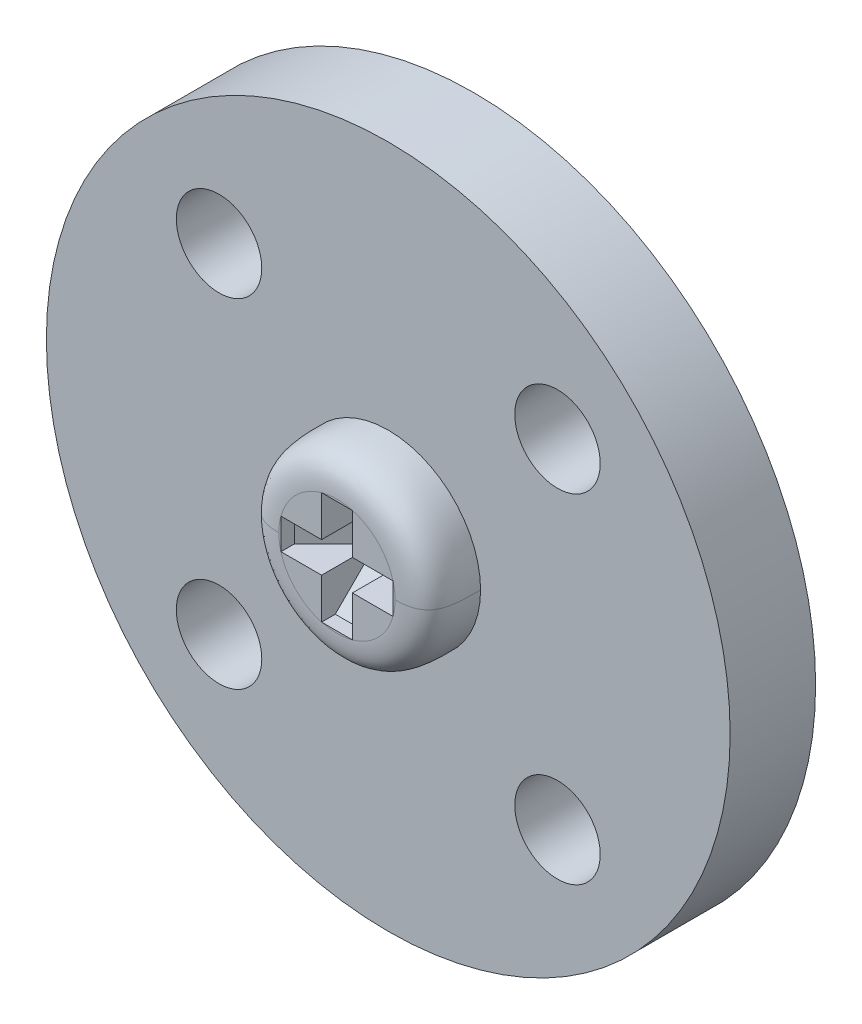
ISO-10303-21;
HEADER;
FILE_DESCRIPTION(('STEP AP214'),'2;1');
FILE_NAME('part.step','',(''),(''),'','','');
FILE_SCHEMA(('AUTOMOTIVE_DESIGN { 1 0 10303 214 1 1 1 1 }'));
ENDSEC;
DATA;
#1=APPLICATION_CONTEXT('core data for automotive mechanical design processes');
#2=APPLICATION_PROTOCOL_DEFINITION('international standard','automotive_design',2000,#1);
#3=PRODUCT_CONTEXT('',#1,'mechanical');
#4=PRODUCT('Part','Part','',(#3));
#5=PRODUCT_RELATED_PRODUCT_CATEGORY('part','',(#4));
#6=PRODUCT_DEFINITION_FORMATION('','',#4);
#7=PRODUCT_DEFINITION_CONTEXT('part definition',#1,'design');
#8=PRODUCT_DEFINITION('design','',#6,#7);
#9=PRODUCT_DEFINITION_SHAPE('','',#8);
#10=(LENGTH_UNIT() NAMED_UNIT(*) SI_UNIT(.MILLI.,.METRE.));
#11=(NAMED_UNIT(*) PLANE_ANGLE_UNIT() SI_UNIT($,.RADIAN.));
#12=(NAMED_UNIT(*) SI_UNIT($,.STERADIAN.) SOLID_ANGLE_UNIT());
#13=UNCERTAINTY_MEASURE_WITH_UNIT(LENGTH_MEASURE(1.E-05),#10,'distance_accuracy_value','');
#14=(GEOMETRIC_REPRESENTATION_CONTEXT(3) GLOBAL_UNCERTAINTY_ASSIGNED_CONTEXT((#13)) GLOBAL_UNIT_ASSIGNED_CONTEXT((#10,
#11,#12)) REPRESENTATION_CONTEXT('',''));
#15=CARTESIAN_POINT('',(0.,0.,0.));
#16=DIRECTION('',(0.,0.,1.));
#17=DIRECTION('',(1.,0.,0.));
#18=AXIS2_PLACEMENT_3D('',#15,#16,#17);
#19=CARTESIAN_POINT('',(12.5,0.,16.2));
#20=DIRECTION('',(0.,0.,1.));
#21=DIRECTION('',(1.,0.,0.));
#22=AXIS2_PLACEMENT_3D('',#19,#20,#21);
#23=PLANE('',#22);
#24=CARTESIAN_POINT('',(12.5,0.,16.2));
#25=DIRECTION('',(0.,0.,-1.));
#26=DIRECTION('',(1.,0.,0.));
#27=AXIS2_PLACEMENT_3D('',#24,#25,#26);
#28=CIRCLE('',#27,4.5);
#29=CARTESIAN_POINT('',(17.,0.,16.2));
#30=VERTEX_POINT('',#29);
#31=EDGE_CURVE('E68',#30,#30,#28,.T.);
#32=ORIENTED_EDGE('',*,*,#31,.F.);
#33=EDGE_LOOP('',(#32));
#34=FACE_BOUND('',#33,.T.);
#35=CARTESIAN_POINT('',(17.4497474683058,-4.94974746830583,16.2));
#36=DIRECTION('',(0.,0.,1.));
#37=DIRECTION('',(1.,0.,0.));
#38=AXIS2_PLACEMENT_3D('',#35,#36,#37);
#39=CIRCLE('',#38,1.25);
#40=CARTESIAN_POINT('',(18.6997474683058,-4.94974746830583,16.2));
#41=VERTEX_POINT('',#40);
#42=EDGE_CURVE('E226',#41,#41,#39,.T.);
#43=ORIENTED_EDGE('',*,*,#42,.T.);
#44=EDGE_LOOP('',(#43));
#45=FACE_BOUND('',#44,.T.);
#46=CARTESIAN_POINT('',(7.55025253169417,-4.94974746830583,16.2));
#47=DIRECTION('',(0.,0.,1.));
#48=DIRECTION('',(1.,0.,0.));
#49=AXIS2_PLACEMENT_3D('',#46,#47,#48);
#50=CIRCLE('',#49,1.25);
#51=CARTESIAN_POINT('',(8.80025253169417,-4.94974746830583,16.2));
#52=VERTEX_POINT('',#51);
#53=EDGE_CURVE('E215',#52,#52,#50,.T.);
#54=ORIENTED_EDGE('',*,*,#53,.T.);
#55=EDGE_LOOP('',(#54));
#56=FACE_BOUND('',#55,.T.);
#57=CARTESIAN_POINT('',(7.55025253169417,4.94974746830583,16.2));
#58=DIRECTION('',(0.,0.,1.));
#59=DIRECTION('',(1.,0.,0.));
#60=AXIS2_PLACEMENT_3D('',#57,#58,#59);
#61=CIRCLE('',#60,1.25);
#62=CARTESIAN_POINT('',(8.80025253169417,4.94974746830583,16.2));
#63=VERTEX_POINT('',#62);
#64=EDGE_CURVE('E208',#63,#63,#61,.T.);
#65=ORIENTED_EDGE('',*,*,#64,.T.);
#66=EDGE_LOOP('',(#65));
#67=FACE_BOUND('',#66,.T.);
#68=CARTESIAN_POINT('',(17.4497474683058,4.94974746830583,16.2));
#69=DIRECTION('',(0.,0.,1.));
#70=DIRECTION('',(1.,0.,0.));
#71=AXIS2_PLACEMENT_3D('',#68,#69,#70);
#72=CIRCLE('',#71,1.25);
#73=CARTESIAN_POINT('',(18.6997474683058,4.94974746830583,16.2));
#74=VERTEX_POINT('',#73);
#75=EDGE_CURVE('E32',#74,#74,#72,.T.);
#76=ORIENTED_EDGE('',*,*,#75,.T.);
#77=EDGE_LOOP('',(#76));
#78=FACE_BOUND('',#77,.T.);
#79=CARTESIAN_POINT('',(12.5,0.,16.2));
#80=DIRECTION('',(0.,0.,1.));
#81=DIRECTION('',(1.,0.,0.));
#82=AXIS2_PLACEMENT_3D('',#79,#80,#81);
#83=CIRCLE('',#82,10.);
#84=CARTESIAN_POINT('',(22.5,0.,16.2));
#85=VERTEX_POINT('',#84);
#86=EDGE_CURVE('E11',#85,#85,#83,.T.);
#87=ORIENTED_EDGE('',*,*,#86,.F.);
#88=EDGE_LOOP('',(#87));
#89=FACE_BOUND('',#88,.T.);
#90=ADVANCED_FACE('F17',(#34,#45,#56,#67,#78,#89),#23,.F.);
#91=CARTESIAN_POINT('',(12.5,0.,18.7));
#92=DIRECTION('',(0.,0.,-1.));
#93=DIRECTION('',(-1.,0.,0.));
#94=AXIS2_PLACEMENT_3D('',#91,#92,#93);
#95=CYLINDRICAL_SURFACE('',#94,10.);
#96=CARTESIAN_POINT('',(12.5,0.,18.7));
#97=DIRECTION('',(0.,0.,1.));
#98=DIRECTION('',(1.,0.,0.));
#99=AXIS2_PLACEMENT_3D('',#96,#97,#98);
#100=CIRCLE('',#99,10.);
#101=CARTESIAN_POINT('',(22.5,0.,18.7));
#102=VERTEX_POINT('',#101);
#103=EDGE_CURVE('E160',#102,#102,#100,.T.);
#104=ORIENTED_EDGE('',*,*,#103,.F.);
#105=EDGE_LOOP('',(#104));
#106=FACE_BOUND('',#105,.T.);
#107=ORIENTED_EDGE('',*,*,#86,.T.);
#108=EDGE_LOOP('',(#107));
#109=FACE_BOUND('',#108,.T.);
#110=ADVANCED_FACE('F401',(#106,#109),#95,.T.);
#111=CARTESIAN_POINT('',(17.4497474683058,4.94974746830583,18.7));
#112=DIRECTION('',(0.,0.,-1.));
#113=DIRECTION('',(-1.,0.,0.));
#114=AXIS2_PLACEMENT_3D('',#111,#112,#113);
#115=CYLINDRICAL_SURFACE('',#114,1.25);
#116=ORIENTED_EDGE('',*,*,#75,.F.);
#117=EDGE_LOOP('',(#116));
#118=FACE_BOUND('',#117,.T.);
#119=CARTESIAN_POINT('',(17.4497474683058,4.94974746830583,18.7));
#120=DIRECTION('',(0.,0.,1.));
#121=DIRECTION('',(1.,0.,0.));
#122=AXIS2_PLACEMENT_3D('',#119,#120,#121);
#123=CIRCLE('',#122,1.25);
#124=CARTESIAN_POINT('',(18.6997474683058,4.94974746830583,18.7));
#125=VERTEX_POINT('',#124);
#126=EDGE_CURVE('E233',#125,#125,#123,.T.);
#127=ORIENTED_EDGE('',*,*,#126,.T.);
#128=EDGE_LOOP('',(#127));
#129=FACE_BOUND('',#128,.T.);
#130=ADVANCED_FACE('F398',(#118,#129),#115,.F.);
#131=CARTESIAN_POINT('',(7.55025253169417,4.94974746830583,18.7));
#132=DIRECTION('',(0.,0.,-1.));
#133=DIRECTION('',(-1.,0.,0.));
#134=AXIS2_PLACEMENT_3D('',#131,#132,#133);
#135=CYLINDRICAL_SURFACE('',#134,1.25);
#136=ORIENTED_EDGE('',*,*,#64,.F.);
#137=EDGE_LOOP('',(#136));
#138=FACE_BOUND('',#137,.T.);
#139=CARTESIAN_POINT('',(7.55025253169417,4.94974746830583,18.7));
#140=DIRECTION('',(0.,0.,1.));
#141=DIRECTION('',(1.,0.,0.));
#142=AXIS2_PLACEMENT_3D('',#139,#140,#141);
#143=CIRCLE('',#142,1.25);
#144=CARTESIAN_POINT('',(8.80025253169417,4.94974746830583,18.7));
#145=VERTEX_POINT('',#144);
#146=EDGE_CURVE('E153',#145,#145,#143,.T.);
#147=ORIENTED_EDGE('',*,*,#146,.T.);
#148=EDGE_LOOP('',(#147));
#149=FACE_BOUND('',#148,.T.);
#150=ADVANCED_FACE('F405',(#138,#149),#135,.F.);
#151=CARTESIAN_POINT('',(7.55025253169417,-4.94974746830583,18.7));
#152=DIRECTION('',(0.,0.,-1.));
#153=DIRECTION('',(-1.,0.,0.));
#154=AXIS2_PLACEMENT_3D('',#151,#152,#153);
#155=CYLINDRICAL_SURFACE('',#154,1.25);
#156=ORIENTED_EDGE('',*,*,#53,.F.);
#157=EDGE_LOOP('',(#156));
#158=FACE_BOUND('',#157,.T.);
#159=CARTESIAN_POINT('',(7.55025253169417,-4.94974746830583,18.7));
#160=DIRECTION('',(0.,0.,1.));
#161=DIRECTION('',(1.,0.,0.));
#162=AXIS2_PLACEMENT_3D('',#159,#160,#161);
#163=CIRCLE('',#162,1.25);
#164=CARTESIAN_POINT('',(8.80025253169417,-4.94974746830583,18.7));
#165=VERTEX_POINT('',#164);
#166=EDGE_CURVE('E199',#165,#165,#163,.T.);
#167=ORIENTED_EDGE('',*,*,#166,.T.);
#168=EDGE_LOOP('',(#167));
#169=FACE_BOUND('',#168,.T.);
#170=ADVANCED_FACE('F578',(#158,#169),#155,.F.);
#171=CARTESIAN_POINT('',(17.4497474683058,-4.94974746830583,18.7));
#172=DIRECTION('',(0.,0.,-1.));
#173=DIRECTION('',(-1.,0.,0.));
#174=AXIS2_PLACEMENT_3D('',#171,#172,#173);
#175=CYLINDRICAL_SURFACE('',#174,1.25);
#176=ORIENTED_EDGE('',*,*,#42,.F.);
#177=EDGE_LOOP('',(#176));
#178=FACE_BOUND('',#177,.T.);
#179=CARTESIAN_POINT('',(17.4497474683058,-4.94974746830583,18.7));
#180=DIRECTION('',(0.,0.,1.));
#181=DIRECTION('',(1.,0.,0.));
#182=AXIS2_PLACEMENT_3D('',#179,#180,#181);
#183=CIRCLE('',#182,1.25);
#184=CARTESIAN_POINT('',(18.6997474683058,-4.94974746830583,18.7));
#185=VERTEX_POINT('',#184);
#186=EDGE_CURVE('E157',#185,#185,#183,.T.);
#187=ORIENTED_EDGE('',*,*,#186,.T.);
#188=EDGE_LOOP('',(#187));
#189=FACE_BOUND('',#188,.T.);
#190=ADVANCED_FACE('F583',(#178,#189),#175,.F.);
#191=CARTESIAN_POINT('',(12.5,0.,18.7));
#192=DIRECTION('',(0.,0.,1.));
#193=DIRECTION('',(1.,0.,0.));
#194=AXIS2_PLACEMENT_3D('',#191,#192,#193);
#195=PLANE('',#194);
#196=ORIENTED_EDGE('',*,*,#126,.F.);
#197=EDGE_LOOP('',(#196));
#198=FACE_BOUND('',#197,.T.);
#199=ORIENTED_EDGE('',*,*,#166,.F.);
#200=EDGE_LOOP('',(#199));
#201=FACE_BOUND('',#200,.T.);
#202=CARTESIAN_POINT('',(12.5,0.,18.7));
#203=DIRECTION('',(0.,0.,-1.));
#204=DIRECTION('',(-1.,0.,0.));
#205=AXIS2_PLACEMENT_3D('',#202,#203,#204);
#206=CIRCLE('',#205,2.70000000000011);
#207=CARTESIAN_POINT('',(9.79999999999978,0.,18.7));
#208=VERTEX_POINT('',#207);
#209=CARTESIAN_POINT('',(15.2,0.,18.7));
#210=VERTEX_POINT('',#209);
#211=EDGE_CURVE('E74',#208,#210,#206,.T.);
#212=ORIENTED_EDGE('',*,*,#211,.T.);
#213=CARTESIAN_POINT('',(12.5,0.,18.7));
#214=DIRECTION('',(0.,0.,-1.));
#215=DIRECTION('',(-1.,0.,0.));
#216=AXIS2_PLACEMENT_3D('',#213,#214,#215);
#217=CIRCLE('',#216,2.70000000000011);
#218=EDGE_CURVE('E58',#210,#208,#217,.T.);
#219=ORIENTED_EDGE('',*,*,#218,.T.);
#220=EDGE_LOOP('',(#212,#219));
#221=FACE_BOUND('',#220,.T.);
#222=ORIENTED_EDGE('',*,*,#186,.F.);
#223=EDGE_LOOP('',(#222));
#224=FACE_BOUND('',#223,.T.);
#225=ORIENTED_EDGE('',*,*,#146,.F.);
#226=EDGE_LOOP('',(#225));
#227=FACE_BOUND('',#226,.T.);
#228=ORIENTED_EDGE('',*,*,#103,.T.);
#229=EDGE_LOOP('',(#228));
#230=FACE_BOUND('',#229,.T.);
#231=ADVANCED_FACE('F72',(#198,#201,#221,#224,#227,#230),#195,.T.);
#232=CARTESIAN_POINT('',(12.5,0.,14.7));
#233=DIRECTION('',(0.,0.,-1.));
#234=DIRECTION('',(0.,-1.,0.));
#235=AXIS2_PLACEMENT_3D('',#232,#233,#234);
#236=PLANE('',#235);
#237=CARTESIAN_POINT('',(12.5,0.,14.7));
#238=DIRECTION('',(0.,0.,-1.));
#239=DIRECTION('',(-1.,0.,0.));
#240=AXIS2_PLACEMENT_3D('',#237,#238,#239);
#241=CIRCLE('',#240,2.4);
#242=CARTESIAN_POINT('',(10.1,0.,14.7));
#243=VERTEX_POINT('',#242);
#244=EDGE_CURVE('E79',#243,#243,#241,.T.);
#245=ORIENTED_EDGE('',*,*,#244,.F.);
#246=EDGE_LOOP('',(#245));
#247=FACE_BOUND('',#246,.T.);
#248=CARTESIAN_POINT('',(12.5,0.,14.7));
#249=DIRECTION('',(0.,0.,-1.));
#250=DIRECTION('',(-1.,0.,0.));
#251=AXIS2_PLACEMENT_3D('',#248,#249,#250);
#252=CIRCLE('',#251,4.5);
#253=CARTESIAN_POINT('',(8.,0.,14.7));
#254=VERTEX_POINT('',#253);
#255=EDGE_CURVE('E236',#254,#254,#252,.T.);
#256=ORIENTED_EDGE('',*,*,#255,.T.);
#257=EDGE_LOOP('',(#256));
#258=FACE_BOUND('',#257,.T.);
#259=ADVANCED_FACE('F621',(#247,#258),#236,.T.);
#260=CARTESIAN_POINT('',(12.5,0.,14.7));
#261=DIRECTION('',(0.,0.,1.));
#262=DIRECTION('',(1.,0.,0.));
#263=AXIS2_PLACEMENT_3D('',#260,#261,#262);
#264=CYLINDRICAL_SURFACE('',#263,4.5);
#265=ORIENTED_EDGE('',*,*,#255,.F.);
#266=EDGE_LOOP('',(#265));
#267=FACE_BOUND('',#266,.T.);
#268=ORIENTED_EDGE('',*,*,#31,.T.);
#269=EDGE_LOOP('',(#268));
#270=FACE_BOUND('',#269,.T.);
#271=ADVANCED_FACE('F618',(#267,#270),#264,.T.);
#272=CARTESIAN_POINT('',(14.2,0.,20.2));
#273=CARTESIAN_POINT('',(14.2,-1.70000000000011,20.2));
#274=CARTESIAN_POINT('',(12.5,-1.70000000000011,20.2));
#275=CARTESIAN_POINT('',(10.7999999999998,-1.70000000000011,20.2));
#276=CARTESIAN_POINT('',(10.7999999999998,0.,20.2));
#277=CARTESIAN_POINT('',(15.1636561930883,0.,20.2));
#278=CARTESIAN_POINT('',(15.1636561930883,-2.66365619308846,20.2));
#279=CARTESIAN_POINT('',(12.5,-2.66365619308846,20.2));
#280=CARTESIAN_POINT('',(9.83634380691143,-2.66365619308846,20.2));
#281=CARTESIAN_POINT('',(9.83634380691143,0.,20.2));
#282=CARTESIAN_POINT('',(15.2,0.,19.6398721910567));
#283=CARTESIAN_POINT('',(15.2,-2.70000000000011,19.6398721910567));
#284=CARTESIAN_POINT('',(12.5,-2.70000000000011,19.6398721910567));
#285=CARTESIAN_POINT('',(9.79999999999979,-2.70000000000011,19.6398721910567));
#286=CARTESIAN_POINT('',(9.79999999999978,0.,19.6398721910567));
#287=CARTESIAN_POINT('',(15.2,0.,18.7));
#288=CARTESIAN_POINT('',(15.2,-2.70000000000011,18.7));
#289=CARTESIAN_POINT('',(12.5,-2.70000000000011,18.7));
#290=CARTESIAN_POINT('',(9.79999999999979,-2.70000000000011,18.7));
#291=CARTESIAN_POINT('',(9.79999999999978,0.,18.7));
#292=(BOUNDED_SURFACE() B_SPLINE_SURFACE(3,2,((#272,#273,#274,#275,#276),(#277,#278,#279,#280,
#281),(#282,#283,#284,#285,#286),(#287,#288,#289,#290,#291)),.UNSPECIFIED.,.F.,.F.,
.F.) B_SPLINE_SURFACE_WITH_KNOTS((4,4),(3,2,3),(0.290349875855344,1.),(0.,1.5707963267949,
3.14159265358979),.UNSPECIFIED.) GEOMETRIC_REPRESENTATION_ITEM() RATIONAL_B_SPLINE_SURFACE(((1.,
0.707106781186548,1.,0.707106781186548,1.),(1.,0.707106781186548,1.,0.707106781186548,1.),(1.,
0.707106781186548,1.,0.707106781186548,1.),(1.,0.707106781186548,1.,0.707106781186548,1.))) REPRESENTATION_ITEM('') SURFACE());
#293=CARTESIAN_POINT('',(10.1,0.,20.0098051501881));
#294=CARTESIAN_POINT('',(9.81569748300469,0.,19.7713566091938));
#295=CARTESIAN_POINT('',(9.79999999999977,0.,19.3176872008984));
#296=CARTESIAN_POINT('',(9.79999999999978,0.,18.7));
#297=B_SPLINE_CURVE_WITH_KNOTS('',3,(#293,#294,#295,#296),.UNSPECIFIED.,.F.,.F.,(4,4),
(0.533615524566944,1.),.UNSPECIFIED.);
#298=CARTESIAN_POINT('',(10.1,0.,20.0098051501881));
#299=VERTEX_POINT('',#298);
#300=EDGE_CURVE('E63',#299,#208,#297,.T.);
#301=CARTESIAN_POINT('',(14.9,0.,20.0098051501879));
#302=CARTESIAN_POINT('',(15.1843025169951,0.,19.7713566091936));
#303=CARTESIAN_POINT('',(15.2,0.,19.3176872008982));
#304=CARTESIAN_POINT('',(15.2,0.,18.7));
#305=B_SPLINE_CURVE_WITH_KNOTS('',3,(#301,#302,#303,#304),.UNSPECIFIED.,.F.,.F.,(4,4),
(0.533615524567073,1.),.UNSPECIFIED.);
#306=CARTESIAN_POINT('',(14.9,0.,20.0098051501879));
#307=VERTEX_POINT('',#306);
#308=EDGE_CURVE('E23',#307,#210,#305,.T.);
#309=CARTESIAN_POINT('',(14.2,0.,20.2));
#310=CARTESIAN_POINT('',(14.5303380651546,0.,20.2));
#311=CARTESIAN_POINT('',(14.7517081080733,0.,20.1341796567696));
#312=CARTESIAN_POINT('',(14.9,0.,20.0098051501879));
#313=B_SPLINE_CURVE_WITH_KNOTS('',3,(#309,#310,#311,#312),.UNSPECIFIED.,.F.,.F.,(4,4),
(0.290349875855344,0.533615524567062),.UNSPECIFIED.);
#314=CARTESIAN_POINT('',(14.2,0.,20.2));
#315=VERTEX_POINT('',#314);
#316=EDGE_CURVE('E67',#315,#307,#313,.T.);
#317=CARTESIAN_POINT('',(12.5,0.,20.2));
#318=DIRECTION('',(0.,0.,-1.));
#319=DIRECTION('',(-1.,0.,0.));
#320=AXIS2_PLACEMENT_3D('',#317,#318,#319);
#321=CIRCLE('',#320,1.70000000000011);
#322=CARTESIAN_POINT('',(14.1393596310755,-0.45,20.2));
#323=VERTEX_POINT('',#322);
#324=EDGE_CURVE('E202',#315,#323,#321,.T.);
#325=CARTESIAN_POINT('',(12.5,0.,20.2));
#326=DIRECTION('',(0.,0.,-1.));
#327=DIRECTION('',(-1.,0.,0.));
#328=AXIS2_PLACEMENT_3D('',#325,#326,#327);
#329=CIRCLE('',#328,1.70000000000011);
#330=CARTESIAN_POINT('',(12.9500000000003,-1.6393596310755,20.2));
#331=VERTEX_POINT('',#330);
#332=EDGE_CURVE('E86',#323,#331,#329,.T.);
#333=CARTESIAN_POINT('',(12.5,0.,20.2));
#334=DIRECTION('',(0.,0.,-1.));
#335=DIRECTION('',(-1.,0.,0.));
#336=AXIS2_PLACEMENT_3D('',#333,#334,#335);
#337=CIRCLE('',#336,1.70000000000011);
#338=CARTESIAN_POINT('',(12.05,-1.63935963107563,20.2));
#339=VERTEX_POINT('',#338);
#340=EDGE_CURVE('E95',#331,#339,#337,.T.);
#341=CARTESIAN_POINT('',(12.5,0.,20.2));
#342=DIRECTION('',(0.,0.,-1.));
#343=DIRECTION('',(-1.,0.,0.));
#344=AXIS2_PLACEMENT_3D('',#341,#342,#343);
#345=CIRCLE('',#344,1.70000000000011);
#346=CARTESIAN_POINT('',(10.8606403689243,-0.450000000000011,20.2));
#347=VERTEX_POINT('',#346);
#348=EDGE_CURVE('E225',#339,#347,#345,.T.);
#349=CARTESIAN_POINT('',(12.5,0.,20.2));
#350=DIRECTION('',(0.,0.,-1.));
#351=DIRECTION('',(-1.,0.,0.));
#352=AXIS2_PLACEMENT_3D('',#349,#350,#351);
#353=CIRCLE('',#352,1.70000000000011);
#354=CARTESIAN_POINT('',(10.7999999999998,0.,20.2));
#355=VERTEX_POINT('',#354);
#356=EDGE_CURVE('E195',#347,#355,#353,.T.);
#357=CARTESIAN_POINT('',(10.7999999999998,0.,20.2));
#358=CARTESIAN_POINT('',(10.4696619348453,0.,20.2));
#359=CARTESIAN_POINT('',(10.2482918919267,0.,20.1341796567697));
#360=CARTESIAN_POINT('',(10.1,0.,20.0098051501881));
#361=B_SPLINE_CURVE_WITH_KNOTS('',3,(#357,#358,#359,#360),.UNSPECIFIED.,.F.,.F.,(4,4),
(0.290349875855344,0.533615524566931),.UNSPECIFIED.);
#362=EDGE_CURVE('E44',#355,#299,#361,.T.);
#363=ORIENTED_EDGE('',*,*,#300,.T.);
#364=ORIENTED_EDGE('',*,*,#218,.F.);
#365=ORIENTED_EDGE('',*,*,#308,.F.);
#366=ORIENTED_EDGE('',*,*,#316,.F.);
#367=ORIENTED_EDGE('',*,*,#324,.T.);
#368=ORIENTED_EDGE('',*,*,#332,.T.);
#369=ORIENTED_EDGE('',*,*,#340,.T.);
#370=ORIENTED_EDGE('',*,*,#348,.T.);
#371=ORIENTED_EDGE('',*,*,#356,.T.);
#372=ORIENTED_EDGE('',*,*,#362,.T.);
#373=EDGE_LOOP('',(#363,#364,#365,#366,#367,#368,#369,#370,#371,#372));
#374=FACE_BOUND('',#373,.T.);
#375=ADVANCED_FACE('F65',(#374),#292,.F.);
#376=CARTESIAN_POINT('',(10.7999999999998,0.,20.2));
#377=CARTESIAN_POINT('',(10.7999999999998,1.70000000000011,20.2));
#378=CARTESIAN_POINT('',(12.5,1.70000000000011,20.2));
#379=CARTESIAN_POINT('',(14.2,1.70000000000011,20.2));
#380=CARTESIAN_POINT('',(14.2,0.,20.2));
#381=CARTESIAN_POINT('',(9.83634380691143,0.,20.2));
#382=CARTESIAN_POINT('',(9.83634380691143,2.66365619308846,20.2));
#383=CARTESIAN_POINT('',(12.5,2.66365619308846,20.2));
#384=CARTESIAN_POINT('',(15.1636561930883,2.66365619308846,20.2));
#385=CARTESIAN_POINT('',(15.1636561930883,0.,20.2));
#386=CARTESIAN_POINT('',(9.79999999999978,0.,19.6398721910567));
#387=CARTESIAN_POINT('',(9.79999999999979,2.70000000000011,19.6398721910567));
#388=CARTESIAN_POINT('',(12.5,2.70000000000011,19.6398721910567));
#389=CARTESIAN_POINT('',(15.2,2.70000000000011,19.6398721910567));
#390=CARTESIAN_POINT('',(15.2,0.,19.6398721910567));
#391=CARTESIAN_POINT('',(9.79999999999978,0.,18.7));
#392=CARTESIAN_POINT('',(9.79999999999979,2.70000000000011,18.7));
#393=CARTESIAN_POINT('',(12.5,2.70000000000011,18.7));
#394=CARTESIAN_POINT('',(15.2,2.70000000000011,18.7));
#395=CARTESIAN_POINT('',(15.2,0.,18.7));
#396=(BOUNDED_SURFACE() B_SPLINE_SURFACE(3,2,((#376,#377,#378,#379,#380),(#381,#382,#383,#384,
#385),(#386,#387,#388,#389,#390),(#391,#392,#393,#394,#395)),.UNSPECIFIED.,.F.,.F.,
.F.) B_SPLINE_SURFACE_WITH_KNOTS((4,4),(3,2,3),(0.290349875855344,1.),(-3.1415926535898,
-1.5707963267949,0.),
.UNSPECIFIED.) GEOMETRIC_REPRESENTATION_ITEM() RATIONAL_B_SPLINE_SURFACE(((1.,0.707106781186548,
1.,0.707106781186548,1.),(1.,0.707106781186548,1.,0.707106781186548,1.),(1.,0.707106781186548,
1.,0.707106781186548,1.),(1.,0.707106781186548,1.,0.707106781186548,1.))) REPRESENTATION_ITEM('') SURFACE());
#397=CARTESIAN_POINT('',(12.5,0.,20.2));
#398=DIRECTION('',(0.,0.,-1.));
#399=DIRECTION('',(-1.,0.,0.));
#400=AXIS2_PLACEMENT_3D('',#397,#398,#399);
#401=CIRCLE('',#400,1.70000000000011);
#402=CARTESIAN_POINT('',(10.8606403689243,0.45,20.2));
#403=VERTEX_POINT('',#402);
#404=EDGE_CURVE('E198',#355,#403,#401,.T.);
#405=CARTESIAN_POINT('',(12.5,0.,20.2));
#406=DIRECTION('',(0.,0.,-1.));
#407=DIRECTION('',(-1.,0.,0.));
#408=AXIS2_PLACEMENT_3D('',#405,#406,#407);
#409=CIRCLE('',#408,1.70000000000011);
#410=CARTESIAN_POINT('',(12.0499999999995,1.6393596310755,20.2));
#411=VERTEX_POINT('',#410);
#412=EDGE_CURVE('E219',#403,#411,#409,.T.);
#413=CARTESIAN_POINT('',(12.5,0.,20.2));
#414=DIRECTION('',(0.,0.,-1.));
#415=DIRECTION('',(-1.,0.,0.));
#416=AXIS2_PLACEMENT_3D('',#413,#414,#415);
#417=CIRCLE('',#416,1.70000000000011);
#418=CARTESIAN_POINT('',(12.9500000000003,1.6393596310755,20.2));
#419=VERTEX_POINT('',#418);
#420=EDGE_CURVE('E216',#411,#419,#417,.T.);
#421=CARTESIAN_POINT('',(12.5,0.,20.2));
#422=DIRECTION('',(0.,0.,-1.));
#423=DIRECTION('',(-1.,0.,0.));
#424=AXIS2_PLACEMENT_3D('',#421,#422,#423);
#425=CIRCLE('',#424,1.70000000000011);
#426=CARTESIAN_POINT('',(14.1393596310755,0.45,20.2));
#427=VERTEX_POINT('',#426);
#428=EDGE_CURVE('E213',#419,#427,#425,.T.);
#429=CARTESIAN_POINT('',(12.5,0.,20.2));
#430=DIRECTION('',(0.,0.,-1.));
#431=DIRECTION('',(-1.,0.,0.));
#432=AXIS2_PLACEMENT_3D('',#429,#430,#431);
#433=CIRCLE('',#432,1.70000000000011);
#434=EDGE_CURVE('E206',#427,#315,#433,.T.);
#435=ORIENTED_EDGE('',*,*,#308,.T.);
#436=ORIENTED_EDGE('',*,*,#211,.F.);
#437=ORIENTED_EDGE('',*,*,#300,.F.);
#438=ORIENTED_EDGE('',*,*,#362,.F.);
#439=ORIENTED_EDGE('',*,*,#404,.T.);
#440=ORIENTED_EDGE('',*,*,#412,.T.);
#441=ORIENTED_EDGE('',*,*,#420,.T.);
#442=ORIENTED_EDGE('',*,*,#428,.T.);
#443=ORIENTED_EDGE('',*,*,#434,.T.);
#444=ORIENTED_EDGE('',*,*,#316,.T.);
#445=EDGE_LOOP('',(#435,#436,#437,#438,#439,#440,#441,#442,#443,#444));
#446=FACE_BOUND('',#445,.T.);
#447=ADVANCED_FACE('F19',(#446),#396,.F.);
#448=CARTESIAN_POINT('',(12.5,0.,16.2));
#449=DIRECTION('',(0.,0.,-1.));
#450=DIRECTION('',(-1.,0.,0.));
#451=AXIS2_PLACEMENT_3D('',#448,#449,#450);
#452=CYLINDRICAL_SURFACE('',#451,2.4);
#453=ORIENTED_EDGE('',*,*,#244,.T.);
#454=EDGE_LOOP('',(#453));
#455=FACE_BOUND('',#454,.T.);
#456=CARTESIAN_POINT('',(12.5,0.,17.4));
#457=DIRECTION('',(0.,0.,1.));
#458=DIRECTION('',(-1.,0.,0.));
#459=AXIS2_PLACEMENT_3D('',#456,#457,#458);
#460=CIRCLE('',#459,2.4);
#461=CARTESIAN_POINT('',(10.1,0.,17.4));
#462=VERTEX_POINT('',#461);
#463=EDGE_CURVE('E911',#462,#462,#460,.T.);
#464=ORIENTED_EDGE('',*,*,#463,.T.);
#465=EDGE_LOOP('',(#464));
#466=FACE_BOUND('',#465,.T.);
#467=ADVANCED_FACE('F595',(#455,#466),#452,.F.);
#468=CARTESIAN_POINT('',(14.2,0.,20.2));
#469=DIRECTION('',(0.,0.,-1.));
#470=DIRECTION('',(0.,-1.,0.));
#471=AXIS2_PLACEMENT_3D('',#468,#469,#470);
#472=PLANE('',#471);
#473=DIRECTION('',(0.,-1.,0.));
#474=VECTOR('',#473,1.);
#475=CARTESIAN_POINT('',(12.95,-0.45,20.2));
#476=LINE('',#475,#474);
#477=CARTESIAN_POINT('',(12.95,-0.45,20.2));
#478=VERTEX_POINT('',#477);
#479=EDGE_CURVE('E189',#478,#331,#476,.T.);
#480=ORIENTED_EDGE('',*,*,#479,.T.);
#481=ORIENTED_EDGE('',*,*,#332,.F.);
#482=DIRECTION('',(1.,0.,0.));
#483=VECTOR('',#482,1.);
#484=CARTESIAN_POINT('',(12.95,-0.45,20.2));
#485=LINE('',#484,#483);
#486=EDGE_CURVE('E104',#478,#323,#485,.T.);
#487=ORIENTED_EDGE('',*,*,#486,.F.);
#488=EDGE_LOOP('',(#480,#481,#487));
#489=FACE_BOUND('',#488,.T.);
#490=ADVANCED_FACE('F573',(#489),#472,.F.);
#491=CARTESIAN_POINT('',(14.2,0.,20.2));
#492=DIRECTION('',(0.,0.,-1.));
#493=DIRECTION('',(0.,-1.,0.));
#494=AXIS2_PLACEMENT_3D('',#491,#492,#493);
#495=PLANE('',#494);
#496=ORIENTED_EDGE('',*,*,#340,.F.);
#497=DIRECTION('',(1.,0.,0.));
#498=VECTOR('',#497,1.);
#499=CARTESIAN_POINT('',(12.05,-1.6393596310755,20.2));
#500=LINE('',#499,#498);
#501=EDGE_CURVE('E183',#339,#331,#500,.T.);
#502=ORIENTED_EDGE('',*,*,#501,.F.);
#503=EDGE_LOOP('',(#496,#502));
#504=FACE_BOUND('',#503,.T.);
#505=ADVANCED_FACE('F564',(#504),#495,.F.);
#506=CARTESIAN_POINT('',(14.2,0.,20.2));
#507=DIRECTION('',(0.,0.,-1.));
#508=DIRECTION('',(0.,-1.,0.));
#509=AXIS2_PLACEMENT_3D('',#506,#507,#508);
#510=PLANE('',#509);
#511=ORIENTED_EDGE('',*,*,#348,.F.);
#512=DIRECTION('',(0.,-1.,0.));
#513=VECTOR('',#512,1.);
#514=CARTESIAN_POINT('',(12.05,-0.45,20.2));
#515=LINE('',#514,#513);
#516=CARTESIAN_POINT('',(12.05,-0.45,20.2));
#517=VERTEX_POINT('',#516);
#518=EDGE_CURVE('E176',#517,#339,#515,.T.);
#519=ORIENTED_EDGE('',*,*,#518,.F.);
#520=DIRECTION('',(1.,0.,0.));
#521=VECTOR('',#520,1.);
#522=CARTESIAN_POINT('',(10.8606403689243,-0.45,20.2));
#523=LINE('',#522,#521);
#524=EDGE_CURVE('E166',#347,#517,#523,.T.);
#525=ORIENTED_EDGE('',*,*,#524,.F.);
#526=EDGE_LOOP('',(#511,#519,#525));
#527=FACE_BOUND('',#526,.T.);
#528=ADVANCED_FACE('F558',(#527),#510,.F.);
#529=CARTESIAN_POINT('',(14.2,0.,20.2));
#530=DIRECTION('',(0.,0.,-1.));
#531=DIRECTION('',(0.,-1.,0.));
#532=AXIS2_PLACEMENT_3D('',#529,#530,#531);
#533=PLANE('',#532);
#534=DIRECTION('',(1.,0.,0.));
#535=VECTOR('',#534,1.);
#536=CARTESIAN_POINT('',(10.8606403689243,0.45,20.2));
#537=LINE('',#536,#535);
#538=CARTESIAN_POINT('',(12.05,0.45,20.2));
#539=VERTEX_POINT('',#538);
#540=EDGE_CURVE('E146',#403,#539,#537,.T.);
#541=ORIENTED_EDGE('',*,*,#540,.T.);
#542=DIRECTION('',(0.,-1.,0.));
#543=VECTOR('',#542,1.);
#544=CARTESIAN_POINT('',(12.05,1.6393596310755,20.2));
#545=LINE('',#544,#543);
#546=EDGE_CURVE('E145',#411,#539,#545,.T.);
#547=ORIENTED_EDGE('',*,*,#546,.F.);
#548=ORIENTED_EDGE('',*,*,#412,.F.);
#549=EDGE_LOOP('',(#541,#547,#548));
#550=FACE_BOUND('',#549,.T.);
#551=ADVANCED_FACE('F549',(#550),#533,.F.);
#552=CARTESIAN_POINT('',(14.2,0.,20.2));
#553=DIRECTION('',(0.,0.,-1.));
#554=DIRECTION('',(0.,-1.,0.));
#555=AXIS2_PLACEMENT_3D('',#552,#553,#554);
#556=PLANE('',#555);
#557=DIRECTION('',(1.,0.,0.));
#558=VECTOR('',#557,1.);
#559=CARTESIAN_POINT('',(12.0499999999995,1.6393596310755,20.2));
#560=LINE('',#559,#558);
#561=EDGE_CURVE('E138',#411,#419,#560,.T.);
#562=ORIENTED_EDGE('',*,*,#561,.T.);
#563=ORIENTED_EDGE('',*,*,#420,.F.);
#564=EDGE_LOOP('',(#562,#563));
#565=FACE_BOUND('',#564,.T.);
#566=ADVANCED_FACE('F526',(#565),#556,.F.);
#567=CARTESIAN_POINT('',(14.2,0.,20.2));
#568=DIRECTION('',(0.,0.,-1.));
#569=DIRECTION('',(0.,-1.,0.));
#570=AXIS2_PLACEMENT_3D('',#567,#568,#569);
#571=PLANE('',#570);
#572=DIRECTION('',(0.,-1.,0.));
#573=VECTOR('',#572,1.);
#574=CARTESIAN_POINT('',(12.95,1.6393596310755,20.2));
#575=LINE('',#574,#573);
#576=CARTESIAN_POINT('',(12.95,0.45,20.2));
#577=VERTEX_POINT('',#576);
#578=EDGE_CURVE('E129',#419,#577,#575,.T.);
#579=ORIENTED_EDGE('',*,*,#578,.T.);
#580=DIRECTION('',(1.,0.,0.));
#581=VECTOR('',#580,1.);
#582=CARTESIAN_POINT('',(12.95,0.45,20.2));
#583=LINE('',#582,#581);
#584=EDGE_CURVE('E119',#577,#427,#583,.T.);
#585=ORIENTED_EDGE('',*,*,#584,.T.);
#586=ORIENTED_EDGE('',*,*,#428,.F.);
#587=EDGE_LOOP('',(#579,#585,#586));
#588=FACE_BOUND('',#587,.T.);
#589=ADVANCED_FACE('F524',(#588),#571,.F.);
#590=CARTESIAN_POINT('',(14.2,0.,20.2));
#591=DIRECTION('',(0.,0.,-1.));
#592=DIRECTION('',(0.,-1.,0.));
#593=AXIS2_PLACEMENT_3D('',#590,#591,#592);
#594=PLANE('',#593);
#595=DIRECTION('',(0.,-1.,0.));
#596=VECTOR('',#595,1.);
#597=CARTESIAN_POINT('',(14.1393596310754,0.45,20.2));
#598=LINE('',#597,#596);
#599=EDGE_CURVE('E115',#427,#323,#598,.T.);
#600=ORIENTED_EDGE('',*,*,#599,.T.);
#601=ORIENTED_EDGE('',*,*,#324,.F.);
#602=ORIENTED_EDGE('',*,*,#434,.F.);
#603=EDGE_LOOP('',(#600,#601,#602));
#604=FACE_BOUND('',#603,.T.);
#605=ADVANCED_FACE('F515',(#604),#594,.F.);
#606=CARTESIAN_POINT('',(14.2,0.,20.2));
#607=DIRECTION('',(0.,0.,-1.));
#608=DIRECTION('',(0.,-1.,0.));
#609=AXIS2_PLACEMENT_3D('',#606,#607,#608);
#610=PLANE('',#609);
#611=ORIENTED_EDGE('',*,*,#356,.F.);
#612=DIRECTION('',(0.,-1.,0.));
#613=VECTOR('',#612,1.);
#614=CARTESIAN_POINT('',(10.8606403689243,0.45,20.2));
#615=LINE('',#614,#613);
#616=EDGE_CURVE('E161',#403,#347,#615,.T.);
#617=ORIENTED_EDGE('',*,*,#616,.F.);
#618=ORIENTED_EDGE('',*,*,#404,.F.);
#619=EDGE_LOOP('',(#611,#617,#618));
#620=FACE_BOUND('',#619,.T.);
#621=ADVANCED_FACE('F503',(#620),#610,.F.);
#622=CARTESIAN_POINT('',(12.95,0.,18.6));
#623=DIRECTION('',(-1.,0.,0.));
#624=DIRECTION('',(0.,0.,1.));
#625=AXIS2_PLACEMENT_3D('',#622,#623,#624);
#626=PLANE('',#625);
#627=DIRECTION('',(0.,0.,1.));
#628=VECTOR('',#627,1.);
#629=CARTESIAN_POINT('',(12.95,-0.45,18.6106403689245));
#630=LINE('',#629,#628);
#631=CARTESIAN_POINT('',(12.95,-0.45,18.6106403689245));
#632=VERTEX_POINT('',#631);
#633=EDGE_CURVE('E99',#632,#478,#630,.T.);
#634=ORIENTED_EDGE('',*,*,#633,.F.);
#635=DIRECTION('',(0.,-0.707106781186549,0.707106781186546));
#636=VECTOR('',#635,1.);
#637=CARTESIAN_POINT('',(12.95,-0.449999999999989,18.6106403689245));
#638=LINE('',#637,#636);
#639=CARTESIAN_POINT('',(12.9500000000003,-1.6393596310755,19.8));
#640=VERTEX_POINT('',#639);
#641=EDGE_CURVE('E844',#632,#640,#638,.T.);
#642=ORIENTED_EDGE('',*,*,#641,.T.);
#643=DIRECTION('',(0.,0.,1.));
#644=VECTOR('',#643,1.);
#645=CARTESIAN_POINT('',(12.9500000000003,-1.6393596310755,19.8));
#646=LINE('',#645,#644);
#647=EDGE_CURVE('E179',#640,#331,#646,.T.);
#648=ORIENTED_EDGE('',*,*,#647,.T.);
#649=ORIENTED_EDGE('',*,*,#479,.F.);
#650=EDGE_LOOP('',(#634,#642,#648,#649));
#651=FACE_BOUND('',#650,.T.);
#652=ADVANCED_FACE('F494',(#651),#626,.T.);
#653=CARTESIAN_POINT('',(0.,-1.6393596310755,18.6));
#654=DIRECTION('',(0.,-1.,0.));
#655=DIRECTION('',(0.,0.,-1.));
#656=AXIS2_PLACEMENT_3D('',#653,#654,#655);
#657=PLANE('',#656);
#658=ORIENTED_EDGE('',*,*,#647,.F.);
#659=DIRECTION('',(-1.,0.,0.));
#660=VECTOR('',#659,1.);
#661=CARTESIAN_POINT('',(12.9500000000003,-1.6393596310755,19.8));
#662=LINE('',#661,#660);
#663=CARTESIAN_POINT('',(12.05,-1.63935963107563,19.8));
#664=VERTEX_POINT('',#663);
#665=EDGE_CURVE('E836',#640,#664,#662,.T.);
#666=ORIENTED_EDGE('',*,*,#665,.T.);
#667=DIRECTION('',(0.,0.,1.));
#668=VECTOR('',#667,1.);
#669=CARTESIAN_POINT('',(12.05,-1.63935963107563,19.8));
#670=LINE('',#669,#668);
#671=EDGE_CURVE('E175',#664,#339,#670,.T.);
#672=ORIENTED_EDGE('',*,*,#671,.T.);
#673=ORIENTED_EDGE('',*,*,#501,.T.);
#674=EDGE_LOOP('',(#658,#666,#672,#673));
#675=FACE_BOUND('',#674,.T.);
#676=ADVANCED_FACE('F481',(#675),#657,.F.);
#677=CARTESIAN_POINT('',(12.05,0.,18.6));
#678=DIRECTION('',(-1.,0.,0.));
#679=DIRECTION('',(0.,0.,1.));
#680=AXIS2_PLACEMENT_3D('',#677,#678,#679);
#681=PLANE('',#680);
#682=ORIENTED_EDGE('',*,*,#671,.F.);
#683=DIRECTION('',(0.,0.707106781186549,-0.707106781186546));
#684=VECTOR('',#683,1.);
#685=CARTESIAN_POINT('',(12.05,-1.63935963107557,19.8));
#686=LINE('',#685,#684);
#687=CARTESIAN_POINT('',(12.05,-0.45,18.6106403689245));
#688=VERTEX_POINT('',#687);
#689=EDGE_CURVE('E841',#664,#688,#686,.T.);
#690=ORIENTED_EDGE('',*,*,#689,.T.);
#691=DIRECTION('',(0.,0.,1.));
#692=VECTOR('',#691,1.);
#693=CARTESIAN_POINT('',(12.05,-0.45,18.6106403689245));
#694=LINE('',#693,#692);
#695=EDGE_CURVE('E170',#688,#517,#694,.T.);
#696=ORIENTED_EDGE('',*,*,#695,.T.);
#697=ORIENTED_EDGE('',*,*,#518,.T.);
#698=EDGE_LOOP('',(#682,#690,#696,#697));
#699=FACE_BOUND('',#698,.T.);
#700=ADVANCED_FACE('F476',(#699),#681,.F.);
#701=CARTESIAN_POINT('',(0.,-0.45,18.6));
#702=DIRECTION('',(0.,-1.,0.));
#703=DIRECTION('',(-1.,0.,0.));
#704=AXIS2_PLACEMENT_3D('',#701,#702,#703);
#705=PLANE('',#704);
#706=ORIENTED_EDGE('',*,*,#695,.F.);
#707=DIRECTION('',(-0.707106781186552,0.,0.707106781186543));
#708=VECTOR('',#707,1.);
#709=CARTESIAN_POINT('',(12.05,-0.45,18.6106403689244));
#710=LINE('',#709,#708);
#711=CARTESIAN_POINT('',(10.8606403689243,-0.450000000000011,19.8));
#712=VERTEX_POINT('',#711);
#713=EDGE_CURVE('E910',#688,#712,#710,.T.);
#714=ORIENTED_EDGE('',*,*,#713,.T.);
#715=DIRECTION('',(0.,0.,1.));
#716=VECTOR('',#715,1.);
#717=CARTESIAN_POINT('',(10.8606403689243,-0.450000000000011,19.8));
#718=LINE('',#717,#716);
#719=EDGE_CURVE('E152',#712,#347,#718,.T.);
#720=ORIENTED_EDGE('',*,*,#719,.T.);
#721=ORIENTED_EDGE('',*,*,#524,.T.);
#722=EDGE_LOOP('',(#706,#714,#720,#721));
#723=FACE_BOUND('',#722,.T.);
#724=ADVANCED_FACE('F466',(#723),#705,.F.);
#725=CARTESIAN_POINT('',(10.8606403689243,0.,18.6));
#726=DIRECTION('',(-1.,0.,0.));
#727=DIRECTION('',(0.,1.,0.));
#728=AXIS2_PLACEMENT_3D('',#725,#726,#727);
#729=PLANE('',#728);
#730=ORIENTED_EDGE('',*,*,#719,.F.);
#731=DIRECTION('',(0.,1.,0.));
#732=VECTOR('',#731,1.);
#733=CARTESIAN_POINT('',(10.8606403689243,-0.450000000000011,19.8));
#734=LINE('',#733,#732);
#735=CARTESIAN_POINT('',(10.8606403689243,0.45,19.8));
#736=VERTEX_POINT('',#735);
#737=EDGE_CURVE('E904',#712,#736,#734,.T.);
#738=ORIENTED_EDGE('',*,*,#737,.T.);
#739=DIRECTION('',(0.,0.,1.));
#740=VECTOR('',#739,1.);
#741=CARTESIAN_POINT('',(10.8606403689243,0.45,19.8));
#742=LINE('',#741,#740);
#743=EDGE_CURVE('E144',#736,#403,#742,.T.);
#744=ORIENTED_EDGE('',*,*,#743,.T.);
#745=ORIENTED_EDGE('',*,*,#616,.T.);
#746=EDGE_LOOP('',(#730,#738,#744,#745));
#747=FACE_BOUND('',#746,.T.);
#748=ADVANCED_FACE('F325',(#747),#729,.F.);
#749=CARTESIAN_POINT('',(0.,0.45,18.6));
#750=DIRECTION('',(0.,-1.,0.));
#751=DIRECTION('',(-1.,0.,0.));
#752=AXIS2_PLACEMENT_3D('',#749,#750,#751);
#753=PLANE('',#752);
#754=ORIENTED_EDGE('',*,*,#743,.F.);
#755=DIRECTION('',(0.707106781186551,0.,-0.707106781186544));
#756=VECTOR('',#755,1.);
#757=CARTESIAN_POINT('',(10.8606403689243,0.45,19.8));
#758=LINE('',#757,#756);
#759=CARTESIAN_POINT('',(12.05,0.45,18.6106403689245));
#760=VERTEX_POINT('',#759);
#761=EDGE_CURVE('E902',#736,#760,#758,.T.);
#762=ORIENTED_EDGE('',*,*,#761,.T.);
#763=DIRECTION('',(0.,0.,1.));
#764=VECTOR('',#763,1.);
#765=CARTESIAN_POINT('',(12.05,0.45,18.6106403689245));
#766=LINE('',#765,#764);
#767=EDGE_CURVE('E136',#760,#539,#766,.T.);
#768=ORIENTED_EDGE('',*,*,#767,.T.);
#769=ORIENTED_EDGE('',*,*,#540,.F.);
#770=EDGE_LOOP('',(#754,#762,#768,#769));
#771=FACE_BOUND('',#770,.T.);
#772=ADVANCED_FACE('F317',(#771),#753,.T.);
#773=CARTESIAN_POINT('',(12.05,0.,18.6));
#774=DIRECTION('',(-1.,0.,0.));
#775=DIRECTION('',(0.,0.,1.));
#776=AXIS2_PLACEMENT_3D('',#773,#774,#775);
#777=PLANE('',#776);
#778=ORIENTED_EDGE('',*,*,#767,.F.);
#779=DIRECTION('',(0.,0.707106781186543,0.707106781186552));
#780=VECTOR('',#779,1.);
#781=CARTESIAN_POINT('',(12.05,1.6393596310755,19.8));
#782=LINE('',#781,#780);
#783=CARTESIAN_POINT('',(12.0499999999995,1.6393596310755,19.8));
#784=VERTEX_POINT('',#783);
#785=EDGE_CURVE('E867',#760,#784,#782,.T.);
#786=ORIENTED_EDGE('',*,*,#785,.T.);
#787=DIRECTION('',(0.,0.,1.));
#788=VECTOR('',#787,1.);
#789=CARTESIAN_POINT('',(12.0499999999995,1.6393596310755,19.8));
#790=LINE('',#789,#788);
#791=EDGE_CURVE('E131',#784,#411,#790,.T.);
#792=ORIENTED_EDGE('',*,*,#791,.T.);
#793=ORIENTED_EDGE('',*,*,#546,.T.);
#794=EDGE_LOOP('',(#778,#786,#792,#793));
#795=FACE_BOUND('',#794,.T.);
#796=ADVANCED_FACE('F322',(#795),#777,.F.);
#797=CARTESIAN_POINT('',(0.,1.6393596310755,18.6));
#798=DIRECTION('',(0.,-1.,0.));
#799=DIRECTION('',(0.,0.,-1.));
#800=AXIS2_PLACEMENT_3D('',#797,#798,#799);
#801=PLANE('',#800);
#802=ORIENTED_EDGE('',*,*,#791,.F.);
#803=DIRECTION('',(1.,0.,0.));
#804=VECTOR('',#803,1.);
#805=CARTESIAN_POINT('',(12.0499999999995,1.6393596310755,19.8));
#806=LINE('',#805,#804);
#807=CARTESIAN_POINT('',(12.9500000000003,1.6393596310755,19.8));
#808=VERTEX_POINT('',#807);
#809=EDGE_CURVE('E861',#784,#808,#806,.T.);
#810=ORIENTED_EDGE('',*,*,#809,.T.);
#811=DIRECTION('',(0.,0.,1.));
#812=VECTOR('',#811,1.);
#813=CARTESIAN_POINT('',(12.9500000000003,1.6393596310755,19.8));
#814=LINE('',#813,#812);
#815=EDGE_CURVE('E121',#808,#419,#814,.T.);
#816=ORIENTED_EDGE('',*,*,#815,.T.);
#817=ORIENTED_EDGE('',*,*,#561,.F.);
#818=EDGE_LOOP('',(#802,#810,#816,#817));
#819=FACE_BOUND('',#818,.T.);
#820=ADVANCED_FACE('F331',(#819),#801,.T.);
#821=CARTESIAN_POINT('',(12.95,0.,18.6));
#822=DIRECTION('',(-1.,0.,0.));
#823=DIRECTION('',(0.,0.,1.));
#824=AXIS2_PLACEMENT_3D('',#821,#822,#823);
#825=PLANE('',#824);
#826=ORIENTED_EDGE('',*,*,#815,.F.);
#827=DIRECTION('',(0.,-0.707106781186543,-0.707106781186552));
#828=VECTOR('',#827,1.);
#829=CARTESIAN_POINT('',(12.95,0.45,18.6106403689245));
#830=LINE('',#829,#828);
#831=CARTESIAN_POINT('',(12.95,0.45,18.6106403689245));
#832=VERTEX_POINT('',#831);
#833=EDGE_CURVE('E880',#808,#832,#830,.T.);
#834=ORIENTED_EDGE('',*,*,#833,.T.);
#835=DIRECTION('',(0.,0.,1.));
#836=VECTOR('',#835,1.);
#837=CARTESIAN_POINT('',(12.95,0.45,18.6106403689245));
#838=LINE('',#837,#836);
#839=EDGE_CURVE('E116',#832,#577,#838,.T.);
#840=ORIENTED_EDGE('',*,*,#839,.T.);
#841=ORIENTED_EDGE('',*,*,#578,.F.);
#842=EDGE_LOOP('',(#826,#834,#840,#841));
#843=FACE_BOUND('',#842,.T.);
#844=ADVANCED_FACE('F328',(#843),#825,.T.);
#845=CARTESIAN_POINT('',(0.,0.45,18.6));
#846=DIRECTION('',(0.,-1.,0.));
#847=DIRECTION('',(-1.,0.,0.));
#848=AXIS2_PLACEMENT_3D('',#845,#846,#847);
#849=PLANE('',#848);
#850=ORIENTED_EDGE('',*,*,#839,.F.);
#851=DIRECTION('',(0.707106781186543,0.,0.707106781186552));
#852=VECTOR('',#851,1.);
#853=CARTESIAN_POINT('',(14.1393596310755,0.45,19.8));
#854=LINE('',#853,#852);
#855=CARTESIAN_POINT('',(14.1393596310755,0.45,19.8));
#856=VERTEX_POINT('',#855);
#857=EDGE_CURVE('E822',#832,#856,#854,.T.);
#858=ORIENTED_EDGE('',*,*,#857,.T.);
#859=DIRECTION('',(0.,0.,1.));
#860=VECTOR('',#859,1.);
#861=CARTESIAN_POINT('',(14.1393596310755,0.45,19.8));
#862=LINE('',#861,#860);
#863=EDGE_CURVE('E108',#856,#427,#862,.T.);
#864=ORIENTED_EDGE('',*,*,#863,.T.);
#865=ORIENTED_EDGE('',*,*,#584,.F.);
#866=EDGE_LOOP('',(#850,#858,#864,#865));
#867=FACE_BOUND('',#866,.T.);
#868=ADVANCED_FACE('F335',(#867),#849,.T.);
#869=CARTESIAN_POINT('',(14.1393596310754,0.,18.6));
#870=DIRECTION('',(-1.,0.,0.));
#871=DIRECTION('',(0.,0.,1.));
#872=AXIS2_PLACEMENT_3D('',#869,#870,#871);
#873=PLANE('',#872);
#874=ORIENTED_EDGE('',*,*,#863,.F.);
#875=DIRECTION('',(0.,-1.,0.));
#876=VECTOR('',#875,1.);
#877=CARTESIAN_POINT('',(14.1393596310754,0.45,19.8));
#878=LINE('',#877,#876);
#879=CARTESIAN_POINT('',(14.1393596310755,-0.45,19.8));
#880=VERTEX_POINT('',#879);
#881=EDGE_CURVE('E812',#856,#880,#878,.T.);
#882=ORIENTED_EDGE('',*,*,#881,.T.);
#883=DIRECTION('',(0.,0.,1.));
#884=VECTOR('',#883,1.);
#885=CARTESIAN_POINT('',(14.1393596310755,-0.45,19.8));
#886=LINE('',#885,#884);
#887=EDGE_CURVE('E96',#880,#323,#886,.T.);
#888=ORIENTED_EDGE('',*,*,#887,.T.);
#889=ORIENTED_EDGE('',*,*,#599,.F.);
#890=EDGE_LOOP('',(#874,#882,#888,#889));
#891=FACE_BOUND('',#890,.T.);
#892=ADVANCED_FACE('F443',(#891),#873,.T.);
#893=CARTESIAN_POINT('',(0.,-0.45,18.6));
#894=DIRECTION('',(0.,-1.,0.));
#895=DIRECTION('',(-1.,0.,0.));
#896=AXIS2_PLACEMENT_3D('',#893,#894,#895);
#897=PLANE('',#896);
#898=ORIENTED_EDGE('',*,*,#887,.F.);
#899=DIRECTION('',(-0.707106781186544,0.,-0.707106781186551));
#900=VECTOR('',#899,1.);
#901=CARTESIAN_POINT('',(12.95,-0.45,18.6106403689245));
#902=LINE('',#901,#900);
#903=EDGE_CURVE('E815',#880,#632,#902,.T.);
#904=ORIENTED_EDGE('',*,*,#903,.T.);
#905=ORIENTED_EDGE('',*,*,#633,.T.);
#906=ORIENTED_EDGE('',*,*,#486,.T.);
#907=EDGE_LOOP('',(#898,#904,#905,#906));
#908=FACE_BOUND('',#907,.T.);
#909=ADVANCED_FACE('F434',(#908),#897,.F.);
#910=CARTESIAN_POINT('',(0.,0.,18.6));
#911=DIRECTION('',(0.,0.,1.));
#912=DIRECTION('',(1.,0.,0.));
#913=AXIS2_PLACEMENT_3D('',#910,#911,#912);
#914=PLANE('',#913);
#915=DIRECTION('',(-1.,0.,0.));
#916=VECTOR('',#915,1.);
#917=CARTESIAN_POINT('',(12.9393596310755,0.43935963107551,18.6));
#918=LINE('',#917,#916);
#919=CARTESIAN_POINT('',(12.9393596310755,0.43935963107551,18.6));
#920=VERTEX_POINT('',#919);
#921=CARTESIAN_POINT('',(12.0606403689243,0.43935963107551,18.6));
#922=VERTEX_POINT('',#921);
#923=EDGE_CURVE('E874',#920,#922,#918,.T.);
#924=ORIENTED_EDGE('',*,*,#923,.T.);
#925=DIRECTION('',(0.,-1.,0.));
#926=VECTOR('',#925,1.);
#927=CARTESIAN_POINT('',(12.0606403689243,0.43935963107551,18.6));
#928=LINE('',#927,#926);
#929=CARTESIAN_POINT('',(12.0606403689243,-0.43935963107549,18.6));
#930=VERTEX_POINT('',#929);
#931=EDGE_CURVE('E925',#922,#930,#928,.T.);
#932=ORIENTED_EDGE('',*,*,#931,.T.);
#933=DIRECTION('',(1.,0.,0.));
#934=VECTOR('',#933,1.);
#935=CARTESIAN_POINT('',(12.0606403689243,-0.43935963107549,18.6));
#936=LINE('',#935,#934);
#937=CARTESIAN_POINT('',(12.9393596310755,-0.43935963107549,18.6));
#938=VERTEX_POINT('',#937);
#939=EDGE_CURVE('E854',#930,#938,#936,.T.);
#940=ORIENTED_EDGE('',*,*,#939,.T.);
#941=DIRECTION('',(0.,1.,0.));
#942=VECTOR('',#941,1.);
#943=CARTESIAN_POINT('',(12.9393596310755,-0.43935963107549,18.6));
#944=LINE('',#943,#942);
#945=EDGE_CURVE('E816',#938,#920,#944,.T.);
#946=ORIENTED_EDGE('',*,*,#945,.T.);
#947=EDGE_LOOP('',(#924,#932,#940,#946));
#948=FACE_BOUND('',#947,.T.);
#949=ADVANCED_FACE('F420',(#948),#914,.T.);
#950=CARTESIAN_POINT('',(14.1393596310754,0.,19.8));
#951=DIRECTION('',(-0.707106781186552,0.,0.707106781186543));
#952=DIRECTION('',(0.,1.,0.));
#953=AXIS2_PLACEMENT_3D('',#950,#951,#952);
#954=PLANE('',#953);
#955=ORIENTED_EDGE('',*,*,#881,.F.);
#956=ORIENTED_EDGE('',*,*,#857,.F.);
#957=DIRECTION('',(0.577350269189702,0.577350269189593,0.577350269189582));
#958=VECTOR('',#957,1.);
#959=CARTESIAN_POINT('',(12.9393596310755,0.439359631075511,18.6));
#960=LINE('',#959,#958);
#961=EDGE_CURVE('E871',#920,#832,#960,.T.);
#962=ORIENTED_EDGE('',*,*,#961,.F.);
#963=ORIENTED_EDGE('',*,*,#945,.F.);
#964=DIRECTION('',(-0.577350269189604,0.577350269189548,-0.577350269189725));
#965=VECTOR('',#964,1.);
#966=CARTESIAN_POINT('',(12.95,-0.449999999999985,18.6106403689245));
#967=LINE('',#966,#965);
#968=EDGE_CURVE('E858',#632,#938,#967,.T.);
#969=ORIENTED_EDGE('',*,*,#968,.F.);
#970=ORIENTED_EDGE('',*,*,#903,.F.);
#971=EDGE_LOOP('',(#955,#956,#962,#963,#969,#970));
#972=FACE_BOUND('',#971,.T.);
#973=ADVANCED_FACE('F385',(#972),#954,.T.);
#974=CARTESIAN_POINT('',(0.,1.6393596310755,19.8));
#975=DIRECTION('',(0.,-0.707106781186552,0.707106781186543));
#976=DIRECTION('',(-1.,0.,0.));
#977=AXIS2_PLACEMENT_3D('',#974,#975,#976);
#978=PLANE('',#977);
#979=ORIENTED_EDGE('',*,*,#809,.F.);
#980=ORIENTED_EDGE('',*,*,#785,.F.);
#981=DIRECTION('',(-0.577350269189636,0.577350269189606,0.577350269189636));
#982=VECTOR('',#981,1.);
#983=CARTESIAN_POINT('',(12.0499999999998,0.44999999999995,18.6106403689244));
#984=LINE('',#983,#982);
#985=EDGE_CURVE('E929',#922,#760,#984,.T.);
#986=ORIENTED_EDGE('',*,*,#985,.F.);
#987=ORIENTED_EDGE('',*,*,#923,.F.);
#988=ORIENTED_EDGE('',*,*,#961,.T.);
#989=ORIENTED_EDGE('',*,*,#833,.F.);
#990=EDGE_LOOP('',(#979,#980,#986,#987,#988,#989));
#991=FACE_BOUND('',#990,.T.);
#992=ADVANCED_FACE('F376',(#991),#978,.T.);
#993=CARTESIAN_POINT('',(0.,-0.43935963107549,18.6));
#994=DIRECTION('',(0.,-0.707106781186545,-0.70710678118655));
#995=DIRECTION('',(0.,-0.70710678118655,0.707106781186545));
#996=AXIS2_PLACEMENT_3D('',#993,#994,#995);
#997=PLANE('',#996);
#998=ORIENTED_EDGE('',*,*,#968,.T.);
#999=ORIENTED_EDGE('',*,*,#939,.F.);
#1000=DIRECTION('',(0.57735026918965,0.577350269189578,-0.57735026918965));
#1001=VECTOR('',#1000,1.);
#1002=CARTESIAN_POINT('',(12.0606403689243,-0.43935963107549,18.6));
#1003=LINE('',#1002,#1001);
#1004=EDGE_CURVE('E848',#688,#930,#1003,.T.);
#1005=ORIENTED_EDGE('',*,*,#1004,.F.);
#1006=ORIENTED_EDGE('',*,*,#689,.F.);
#1007=ORIENTED_EDGE('',*,*,#665,.F.);
#1008=ORIENTED_EDGE('',*,*,#641,.F.);
#1009=EDGE_LOOP('',(#998,#999,#1005,#1006,#1007,#1008));
#1010=FACE_BOUND('',#1009,.T.);
#1011=ADVANCED_FACE('F382',(#1010),#997,.F.);
#1012=CARTESIAN_POINT('',(12.0606403689243,0.,18.6));
#1013=DIRECTION('',(-0.707106781186543,0.,-0.707106781186552));
#1014=DIRECTION('',(-0.707106781186552,0.,0.707106781186543));
#1015=AXIS2_PLACEMENT_3D('',#1012,#1013,#1014);
#1016=PLANE('',#1015);
#1017=ORIENTED_EDGE('',*,*,#761,.F.);
#1018=ORIENTED_EDGE('',*,*,#737,.F.);
#1019=ORIENTED_EDGE('',*,*,#713,.F.);
#1020=ORIENTED_EDGE('',*,*,#1004,.T.);
#1021=ORIENTED_EDGE('',*,*,#931,.F.);
#1022=ORIENTED_EDGE('',*,*,#985,.T.);
#1023=EDGE_LOOP('',(#1017,#1018,#1019,#1020,#1021,#1022));
#1024=FACE_BOUND('',#1023,.T.);
#1025=ADVANCED_FACE('F358',(#1024),#1016,.F.);
#1026=CARTESIAN_POINT('',(12.5,0.,17.4));
#1027=DIRECTION('',(0.,0.,1.));
#1028=DIRECTION('',(1.,0.,0.));
#1029=AXIS2_PLACEMENT_3D('',#1026,#1027,#1028);
#1030=PLANE('',#1029);
#1031=CARTESIAN_POINT('',(12.5,0.,17.4));
#1032=DIRECTION('',(0.,0.,1.));
#1033=DIRECTION('',(-1.,0.,0.));
#1034=AXIS2_PLACEMENT_3D('',#1031,#1032,#1033);
#1035=CIRCLE('',#1034,1.4635);
#1036=CARTESIAN_POINT('',(11.0365,0.,17.4));
#1037=VERTEX_POINT('',#1036);
#1038=EDGE_CURVE('E909',#1037,#1037,#1035,.T.);
#1039=ORIENTED_EDGE('',*,*,#1038,.T.);
#1040=EDGE_LOOP('',(#1039));
#1041=FACE_BOUND('',#1040,.T.);
#1042=ORIENTED_EDGE('',*,*,#463,.F.);
#1043=EDGE_LOOP('',(#1042));
#1044=FACE_BOUND('',#1043,.T.);
#1045=ADVANCED_FACE('F353',(#1041,#1044),#1030,.F.);
#1046=CARTESIAN_POINT('',(12.5,0.,11.4));
#1047=DIRECTION('',(0.,0.,1.));
#1048=DIRECTION('',(1.,0.,0.));
#1049=AXIS2_PLACEMENT_3D('',#1046,#1047,#1048);
#1050=PLANE('',#1049);
#1051=CARTESIAN_POINT('',(12.5,0.,11.4));
#1052=DIRECTION('',(0.,0.,1.));
#1053=DIRECTION('',(-1.,0.,0.));
#1054=AXIS2_PLACEMENT_3D('',#1051,#1052,#1053);
#1055=CIRCLE('',#1054,1.3635);
#1056=CARTESIAN_POINT('',(11.1365,0.,11.4));
#1057=VERTEX_POINT('',#1056);
#1058=EDGE_CURVE('E955',#1057,#1057,#1055,.T.);
#1059=ORIENTED_EDGE('',*,*,#1058,.F.);
#1060=EDGE_LOOP('',(#1059));
#1061=FACE_BOUND('',#1060,.T.);
#1062=ADVANCED_FACE('F343',(#1061),#1050,.F.);
#1063=CARTESIAN_POINT('',(12.5,0.,17.4));
#1064=DIRECTION('',(0.,0.,-1.));
#1065=DIRECTION('',(-1.,0.,0.));
#1066=AXIS2_PLACEMENT_3D('',#1063,#1064,#1065);
#1067=CYLINDRICAL_SURFACE('',#1066,1.4635);
#1068=ORIENTED_EDGE('',*,*,#1038,.F.);
#1069=EDGE_LOOP('',(#1068));
#1070=FACE_BOUND('',#1069,.T.);
#1071=CARTESIAN_POINT('',(12.5,0.,11.5));
#1072=DIRECTION('',(0.,0.,-1.));
#1073=DIRECTION('',(-1.,0.,0.));
#1074=AXIS2_PLACEMENT_3D('',#1071,#1072,#1073);
#1075=CIRCLE('',#1074,1.4635);
#1076=CARTESIAN_POINT('',(11.0365,0.,11.5));
#1077=VERTEX_POINT('',#1076);
#1078=EDGE_CURVE('E915',#1077,#1077,#1075,.T.);
#1079=ORIENTED_EDGE('',*,*,#1078,.F.);
#1080=EDGE_LOOP('',(#1079));
#1081=FACE_BOUND('',#1080,.T.);
#1082=ADVANCED_FACE('F309',(#1070,#1081),#1067,.T.);
#1083=CARTESIAN_POINT('',(12.5,0.,11.45));
#1084=DIRECTION('',(0.,0.,1.));
#1085=DIRECTION('',(-1.,0.,0.));
#1086=AXIS2_PLACEMENT_3D('',#1083,#1084,#1085);
#1087=CONICAL_SURFACE('',#1086,1.4135,0.785398163397448);
#1088=ORIENTED_EDGE('',*,*,#1078,.T.);
#1089=EDGE_LOOP('',(#1088));
#1090=FACE_BOUND('',#1089,.T.);
#1091=ORIENTED_EDGE('',*,*,#1058,.T.);
#1092=EDGE_LOOP('',(#1091));
#1093=FACE_BOUND('',#1092,.T.);
#1094=ADVANCED_FACE('F306',(#1090,#1093),#1087,.T.);
#1095=CLOSED_SHELL('',(#90,#110,#130,#150,#170,#190,#231,#259,#271,#375,#447,#467,#490,#505,
#528,#551,#566,#589,#605,#621,#652,#676,#700,#724,#748,#772,#796,#820,#844,#868,#892,#909,#949,
#973,#992,#1011,#1025,#1045,#1062,#1082,#1094));
#1096=MANIFOLD_SOLID_BREP('B1',#1095);
#1097=ADVANCED_BREP_SHAPE_REPRESENTATION('',(#18,#1096),#14);
#1098=SHAPE_DEFINITION_REPRESENTATION(#9,#1097);
ENDSEC;
END-ISO-10303-21;
